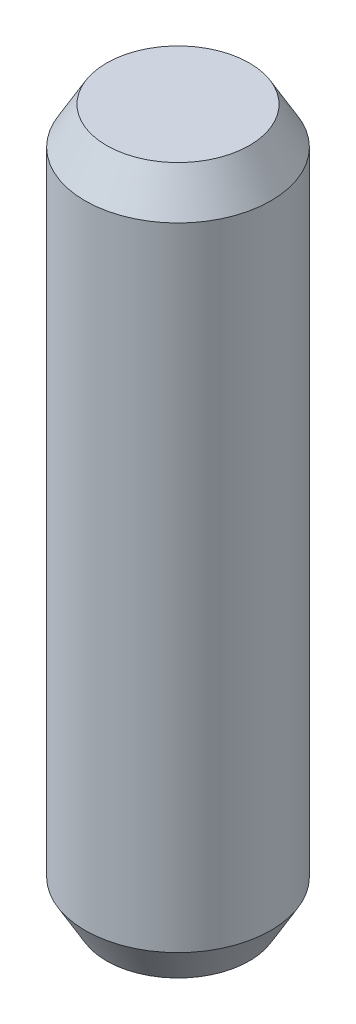
ISO-10303-21;
HEADER;
FILE_DESCRIPTION(('STEP AP214'),'2;1');
FILE_NAME('part.step','',(''),(''),'','','');
FILE_SCHEMA(('AUTOMOTIVE_DESIGN { 1 0 10303 214 1 1 1 1 }'));
ENDSEC;
DATA;
#1=APPLICATION_CONTEXT('core data for automotive mechanical design processes');
#2=APPLICATION_PROTOCOL_DEFINITION('international standard','automotive_design',2000,#1);
#3=PRODUCT_CONTEXT('',#1,'mechanical');
#4=PRODUCT('Part','Part','',(#3));
#5=PRODUCT_RELATED_PRODUCT_CATEGORY('part','',(#4));
#6=PRODUCT_DEFINITION_FORMATION('','',#4);
#7=PRODUCT_DEFINITION_CONTEXT('part definition',#1,'design');
#8=PRODUCT_DEFINITION('design','',#6,#7);
#9=PRODUCT_DEFINITION_SHAPE('','',#8);
#10=(LENGTH_UNIT() NAMED_UNIT(*) SI_UNIT(.MILLI.,.METRE.));
#11=(NAMED_UNIT(*) PLANE_ANGLE_UNIT() SI_UNIT($,.RADIAN.));
#12=(NAMED_UNIT(*) SI_UNIT($,.STERADIAN.) SOLID_ANGLE_UNIT());
#13=UNCERTAINTY_MEASURE_WITH_UNIT(LENGTH_MEASURE(1.E-05),#10,'distance_accuracy_value','');
#14=(GEOMETRIC_REPRESENTATION_CONTEXT(3) GLOBAL_UNCERTAINTY_ASSIGNED_CONTEXT((#13)) GLOBAL_UNIT_ASSIGNED_CONTEXT((#10,
#11,#12)) REPRESENTATION_CONTEXT('',''));
#15=CARTESIAN_POINT('',(0.,0.,0.));
#16=DIRECTION('',(0.,0.,1.));
#17=DIRECTION('',(1.,0.,0.));
#18=AXIS2_PLACEMENT_3D('',#15,#16,#17);
#19=CARTESIAN_POINT('',(0.,24.13,0.));
#20=DIRECTION('',(0.,-1.,0.));
#21=DIRECTION('',(0.,0.,-1.));
#22=AXIS2_PLACEMENT_3D('',#19,#20,#21);
#23=CYLINDRICAL_SURFACE('',#22,3.175);
#24=CARTESIAN_POINT('',(0.,1.27,0.));
#25=DIRECTION('',(0.,1.,0.));
#26=DIRECTION('',(0.,0.,1.));
#27=AXIS2_PLACEMENT_3D('',#24,#25,#26);
#28=CIRCLE('',#27,3.175);
#29=CARTESIAN_POINT('',(0.,1.27,-3.175));
#30=VERTEX_POINT('',#29);
#31=EDGE_CURVE('E49',#30,#30,#28,.T.);
#32=CARTESIAN_POINT('',(0.,22.86,0.));
#33=DIRECTION('',(0.,1.,0.));
#34=DIRECTION('',(0.,0.,1.));
#35=AXIS2_PLACEMENT_3D('',#32,#33,#34);
#36=CIRCLE('',#35,3.175);
#37=CARTESIAN_POINT('',(0.,22.86,-3.175));
#38=VERTEX_POINT('',#37);
#39=EDGE_CURVE('E53',#38,#38,#36,.F.);
#40=CARTESIAN_POINT('',(0.,1.27,-3.175));
#41=CARTESIAN_POINT('',(0.,1.49489583333333,-3.175));
#42=CARTESIAN_POINT('',(0.,1.71979166666666,-3.175));
#43=CARTESIAN_POINT('',(0.,2.16958333333333,-3.175));
#44=CARTESIAN_POINT('',(0.,2.39447916666666,-3.175));
#45=CARTESIAN_POINT('',(0.,2.84427083333333,-3.175));
#46=CARTESIAN_POINT('',(0.,3.06916666666666,-3.175));
#47=CARTESIAN_POINT('',(0.,3.51895833333333,-3.175));
#48=CARTESIAN_POINT('',(0.,3.74385416666667,-3.175));
#49=CARTESIAN_POINT('',(0.,4.19364583333333,-3.175));
#50=CARTESIAN_POINT('',(0.,4.41854166666667,-3.175));
#51=CARTESIAN_POINT('',(0.,4.86833333333333,-3.175));
#52=CARTESIAN_POINT('',(0.,5.09322916666667,-3.175));
#53=CARTESIAN_POINT('',(0.,5.54302083333333,-3.175));
#54=CARTESIAN_POINT('',(0.,5.76791666666667,-3.175));
#55=CARTESIAN_POINT('',(0.,6.21770833333333,-3.175));
#56=CARTESIAN_POINT('',(0.,6.44260416666667,-3.175));
#57=CARTESIAN_POINT('',(0.,6.89239583333333,-3.175));
#58=CARTESIAN_POINT('',(0.,7.11729166666667,-3.175));
#59=CARTESIAN_POINT('',(0.,7.56708333333334,-3.175));
#60=CARTESIAN_POINT('',(0.,7.79197916666667,-3.175));
#61=CARTESIAN_POINT('',(0.,8.24177083333334,-3.175));
#62=CARTESIAN_POINT('',(0.,8.46666666666667,-3.175));
#63=CARTESIAN_POINT('',(0.,8.91645833333333,-3.175));
#64=CARTESIAN_POINT('',(0.,9.14135416666667,-3.175));
#65=CARTESIAN_POINT('',(0.,9.59114583333334,-3.175));
#66=CARTESIAN_POINT('',(0.,9.81604166666667,-3.175));
#67=CARTESIAN_POINT('',(0.,10.2658333333333,-3.175));
#68=CARTESIAN_POINT('',(0.,10.4907291666667,-3.175));
#69=CARTESIAN_POINT('',(0.,10.9405208333333,-3.175));
#70=CARTESIAN_POINT('',(0.,11.1654166666667,-3.175));
#71=CARTESIAN_POINT('',(0.,11.6152083333333,-3.175));
#72=CARTESIAN_POINT('',(0.,11.8401041666667,-3.175));
#73=CARTESIAN_POINT('',(0.,12.2898958333333,-3.175));
#74=CARTESIAN_POINT('',(0.,12.5147916666667,-3.175));
#75=CARTESIAN_POINT('',(0.,12.9645833333333,-3.175));
#76=CARTESIAN_POINT('',(0.,13.1894791666667,-3.175));
#77=CARTESIAN_POINT('',(0.,13.6392708333333,-3.175));
#78=CARTESIAN_POINT('',(0.,13.8641666666667,-3.175));
#79=CARTESIAN_POINT('',(0.,14.3139583333333,-3.175));
#80=CARTESIAN_POINT('',(0.,14.5388541666667,-3.175));
#81=CARTESIAN_POINT('',(0.,14.9886458333333,-3.175));
#82=CARTESIAN_POINT('',(0.,15.2135416666667,-3.175));
#83=CARTESIAN_POINT('',(0.,15.6633333333333,-3.175));
#84=CARTESIAN_POINT('',(0.,15.8882291666667,-3.175));
#85=CARTESIAN_POINT('',(0.,16.3380208333333,-3.175));
#86=CARTESIAN_POINT('',(0.,16.5629166666667,-3.175));
#87=CARTESIAN_POINT('',(0.,17.0127083333333,-3.175));
#88=CARTESIAN_POINT('',(0.,17.2376041666667,-3.175));
#89=CARTESIAN_POINT('',(0.,17.6873958333333,-3.175));
#90=CARTESIAN_POINT('',(0.,17.9122916666667,-3.175));
#91=CARTESIAN_POINT('',(0.,18.3620833333333,-3.175));
#92=CARTESIAN_POINT('',(0.,18.5869791666667,-3.175));
#93=CARTESIAN_POINT('',(0.,19.0367708333333,-3.175));
#94=CARTESIAN_POINT('',(0.,19.2616666666667,-3.175));
#95=CARTESIAN_POINT('',(0.,19.7114583333333,-3.175));
#96=CARTESIAN_POINT('',(0.,19.9363541666667,-3.175));
#97=CARTESIAN_POINT('',(0.,20.3861458333333,-3.175));
#98=CARTESIAN_POINT('',(0.,20.6110416666667,-3.175));
#99=CARTESIAN_POINT('',(0.,21.0608333333333,-3.175));
#100=CARTESIAN_POINT('',(0.,21.2857291666667,-3.175));
#101=CARTESIAN_POINT('',(0.,21.7355208333333,-3.175));
#102=CARTESIAN_POINT('',(0.,21.9604166666667,-3.175));
#103=CARTESIAN_POINT('',(0.,22.4102083333333,-3.175));
#104=CARTESIAN_POINT('',(0.,22.6351041666667,-3.175));
#105=CARTESIAN_POINT('',(0.,22.86,-3.175));
#106=B_SPLINE_CURVE_WITH_KNOTS('',3,(#40,#41,#42,#43,#44,#45,#46,#47,#48,#49,#50,#51,#52,#53,
#54,#55,#56,#57,#58,#59,#60,#61,#62,#63,#64,#65,#66,#67,#68,#69,#70,#71,#72,#73,#74,#75,#76,#77,
#78,#79,#80,#81,#82,#83,#84,#85,#86,#87,#88,#89,#90,#91,#92,#93,#94,#95,#96,#97,#98,#99,#100,
#101,#102,#103,#104,#105),.UNSPECIFIED.,.F.,.F.,(4,2,2,2,2,2,2,2,2,2,2,2,2,2,2,2,2,2,2,2,2,2,2,
2,2,2,2,2,2,2,2,2,4),(0.,0.6746875,1.349375,2.0240625,2.69875,3.3734375,4.048125,4.7228125,
5.3975,6.07218750000001,6.74687500000001,7.4215625,8.09625,8.7709375,9.44562500000001,
10.1203125,10.795,11.4696875,12.144375,12.8190625,13.49375,14.1684375,14.843125,15.5178125,
16.1925,16.8671875,17.541875,18.2165625,18.89125,19.5659375,20.240625,20.9153125,21.59),.UNSPECIFIED.);
#107=EDGE_CURVE('BSEAM37',#30,#38,#106,.T.);
#108=ORIENTED_EDGE('',*,*,#31,.T.);
#109=ORIENTED_EDGE('',*,*,#39,.T.);
#110=ORIENTED_EDGE('',*,*,#107,.T.);
#111=ORIENTED_EDGE('',*,*,#107,.F.);
#112=EDGE_LOOP('',(#108,#110,#109,#111));
#113=FACE_BOUND('',#112,.T.);
#114=ADVANCED_FACE('F37',(#113),#23,.T.);
#115=CARTESIAN_POINT('',(0.,24.13,0.));
#116=DIRECTION('',(0.,1.,0.));
#117=DIRECTION('',(0.,0.,1.));
#118=AXIS2_PLACEMENT_3D('',#115,#116,#117);
#119=PLANE('',#118);
#120=CARTESIAN_POINT('',(0.,24.13,0.));
#121=DIRECTION('',(0.,1.,0.));
#122=DIRECTION('',(0.,0.,1.));
#123=AXIS2_PLACEMENT_3D('',#120,#121,#122);
#124=CIRCLE('',#123,2.44176515812919);
#125=CARTESIAN_POINT('',(0.,24.13,2.44176515812919));
#126=VERTEX_POINT('',#125);
#127=EDGE_CURVE('E10',#126,#126,#124,.T.);
#128=ORIENTED_EDGE('',*,*,#127,.T.);
#129=EDGE_LOOP('',(#128));
#130=FACE_BOUND('',#129,.T.);
#131=ADVANCED_FACE('F69',(#130),#119,.T.);
#132=CARTESIAN_POINT('',(0.,0.,0.));
#133=DIRECTION('',(0.,1.,0.));
#134=DIRECTION('',(0.,0.,1.));
#135=AXIS2_PLACEMENT_3D('',#132,#133,#134);
#136=PLANE('',#135);
#137=CARTESIAN_POINT('',(0.,0.,0.));
#138=DIRECTION('',(0.,1.,0.));
#139=DIRECTION('',(0.,0.,1.));
#140=AXIS2_PLACEMENT_3D('',#137,#138,#139);
#141=CIRCLE('',#140,2.44176515812918);
#142=CARTESIAN_POINT('',(0.,0.,2.44176515812918));
#143=VERTEX_POINT('',#142);
#144=EDGE_CURVE('E45',#143,#143,#141,.F.);
#145=ORIENTED_EDGE('',*,*,#144,.T.);
#146=EDGE_LOOP('',(#145));
#147=FACE_BOUND('',#146,.T.);
#148=ADVANCED_FACE('F66',(#147),#136,.F.);
#149=CARTESIAN_POINT('',(0.,1.27,0.));
#150=DIRECTION('',(0.,1.,0.));
#151=DIRECTION('',(0.,0.,1.));
#152=AXIS2_PLACEMENT_3D('',#149,#150,#151);
#153=CONICAL_SURFACE('',#152,3.175,0.523598775598299);
#154=ORIENTED_EDGE('',*,*,#144,.F.);
#155=EDGE_LOOP('',(#154));
#156=FACE_BOUND('',#155,.T.);
#157=ORIENTED_EDGE('',*,*,#31,.F.);
#158=EDGE_LOOP('',(#157));
#159=FACE_BOUND('',#158,.T.);
#160=ADVANCED_FACE('F62',(#156,#159),#153,.T.);
#161=CARTESIAN_POINT('',(0.,24.13,0.));
#162=DIRECTION('',(0.,-1.,0.));
#163=DIRECTION('',(0.,0.,-1.));
#164=AXIS2_PLACEMENT_3D('',#161,#162,#163);
#165=CONICAL_SURFACE('',#164,2.44176515812919,0.523598775598298);
#166=ORIENTED_EDGE('',*,*,#39,.F.);
#167=EDGE_LOOP('',(#166));
#168=FACE_BOUND('',#167,.T.);
#169=ORIENTED_EDGE('',*,*,#127,.F.);
#170=EDGE_LOOP('',(#169));
#171=FACE_BOUND('',#170,.T.);
#172=ADVANCED_FACE('F40',(#168,#171),#165,.T.);
#173=CLOSED_SHELL('',(#114,#131,#148,#160,#172));
#174=MANIFOLD_SOLID_BREP('B2',#173);
#175=ADVANCED_BREP_SHAPE_REPRESENTATION('',(#18,#174),#14);
#176=SHAPE_DEFINITION_REPRESENTATION(#9,#175);
ENDSEC;
END-ISO-10303-21;
